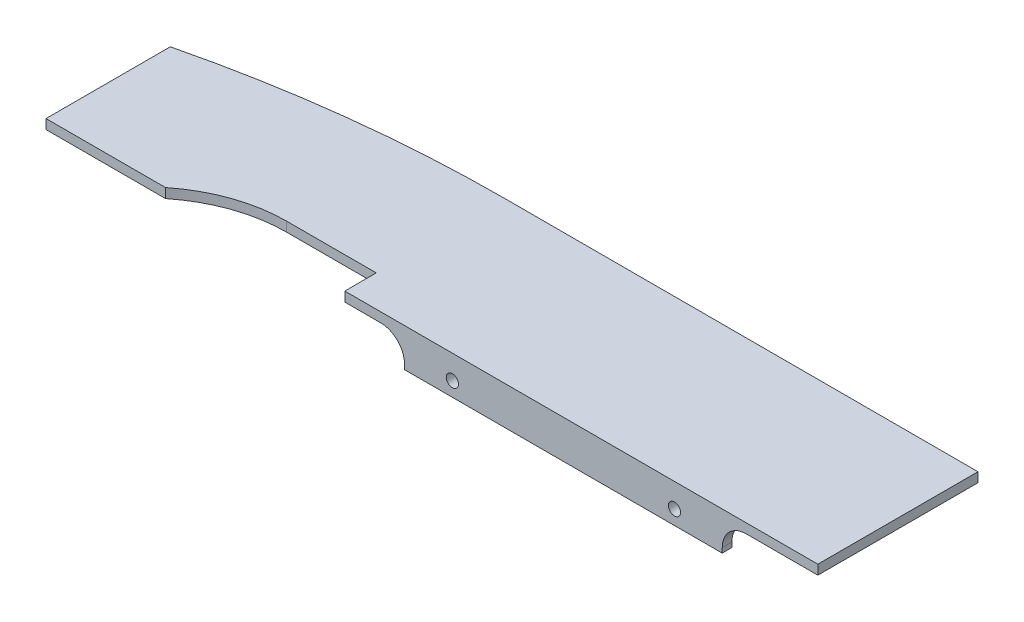
ISO-10303-21;
HEADER;
FILE_DESCRIPTION(('STEP AP214'),'2;1');
FILE_NAME('part.step','',(''),(''),'','','');
FILE_SCHEMA(('AUTOMOTIVE_DESIGN { 1 0 10303 214 1 1 1 1 }'));
ENDSEC;
DATA;
#1=APPLICATION_CONTEXT('core data for automotive mechanical design processes');
#2=APPLICATION_PROTOCOL_DEFINITION('international standard','automotive_design',2000,#1);
#3=PRODUCT_CONTEXT('',#1,'mechanical');
#4=PRODUCT('Part','Part','',(#3));
#5=PRODUCT_RELATED_PRODUCT_CATEGORY('part','',(#4));
#6=PRODUCT_DEFINITION_FORMATION('','',#4);
#7=PRODUCT_DEFINITION_CONTEXT('part definition',#1,'design');
#8=PRODUCT_DEFINITION('design','',#6,#7);
#9=PRODUCT_DEFINITION_SHAPE('','',#8);
#10=(LENGTH_UNIT() NAMED_UNIT(*) SI_UNIT(.MILLI.,.METRE.));
#11=(NAMED_UNIT(*) PLANE_ANGLE_UNIT() SI_UNIT($,.RADIAN.));
#12=(NAMED_UNIT(*) SI_UNIT($,.STERADIAN.) SOLID_ANGLE_UNIT());
#13=UNCERTAINTY_MEASURE_WITH_UNIT(LENGTH_MEASURE(1.E-05),#10,'distance_accuracy_value','');
#14=(GEOMETRIC_REPRESENTATION_CONTEXT(3) GLOBAL_UNCERTAINTY_ASSIGNED_CONTEXT((#13)) GLOBAL_UNIT_ASSIGNED_CONTEXT((#10,
#11,#12)) REPRESENTATION_CONTEXT('',''));
#15=CARTESIAN_POINT('',(0.,0.,0.));
#16=DIRECTION('',(0.,0.,1.));
#17=DIRECTION('',(1.,0.,0.));
#18=AXIS2_PLACEMENT_3D('',#15,#16,#17);
#19=CARTESIAN_POINT('',(-207.917449812527,59.7999999999989,0.));
#20=DIRECTION('',(1.,0.,0.));
#21=DIRECTION('',(0.,1.,0.));
#22=AXIS2_PLACEMENT_3D('',#19,#20,#21);
#23=PLANE('',#22);
#24=DIRECTION('',(0.,1.,0.));
#25=VECTOR('',#24,1.);
#26=CARTESIAN_POINT('',(-207.917449812527,-86.0238343861886,53.8374849879851));
#27=LINE('',#26,#25);
#28=CARTESIAN_POINT('',(-207.917449812527,55.7999999999989,53.8374849879851));
#29=VERTEX_POINT('',#28);
#30=CARTESIAN_POINT('',(-207.917449812527,59.7999999999989,53.8374849879851));
#31=VERTEX_POINT('',#30);
#32=EDGE_CURVE('E63',#29,#31,#27,.T.);
#33=ORIENTED_EDGE('',*,*,#32,.F.);
#34=DIRECTION('',(0.,0.,1.));
#35=VECTOR('',#34,1.);
#36=CARTESIAN_POINT('',(-207.917449812527,55.7999999999989,0.));
#37=LINE('',#36,#35);
#38=CARTESIAN_POINT('',(-207.917449812527,55.7999999999989,66.9999999999997));
#39=VERTEX_POINT('',#38);
#40=EDGE_CURVE('E302',#29,#39,#37,.T.);
#41=ORIENTED_EDGE('',*,*,#40,.T.);
#42=DIRECTION('',(0.,-1.,0.));
#43=VECTOR('',#42,1.);
#44=CARTESIAN_POINT('',(-207.917449812527,59.7999999999989,66.9999999999997));
#45=LINE('',#44,#43);
#46=CARTESIAN_POINT('',(-207.917449812527,59.7999999999989,66.9999999999997));
#47=VERTEX_POINT('',#46);
#48=EDGE_CURVE('E340',#47,#39,#45,.T.);
#49=ORIENTED_EDGE('',*,*,#48,.F.);
#50=DIRECTION('',(0.,0.,1.));
#51=VECTOR('',#50,1.);
#52=CARTESIAN_POINT('',(-207.917449812527,59.7999999999989,0.));
#53=LINE('',#52,#51);
#54=EDGE_CURVE('E303',#31,#47,#53,.T.);
#55=ORIENTED_EDGE('',*,*,#54,.F.);
#56=EDGE_LOOP('',(#33,#41,#49,#55));
#57=FACE_BOUND('',#56,.T.);
#58=ADVANCED_FACE('F41',(#57),#23,.F.);
#59=CARTESIAN_POINT('',(-1.60418411700392E-13,55.7999999999995,0.));
#60=DIRECTION('',(0.,1.,0.));
#61=DIRECTION('',(-1.,0.,0.));
#62=AXIS2_PLACEMENT_3D('',#59,#60,#61);
#63=PLANE('',#62);
#64=DIRECTION('',(0.,0.,1.));
#65=VECTOR('',#64,1.);
#66=CARTESIAN_POINT('',(-40.,55.7999999999994,62.9999999999997));
#67=LINE('',#66,#65);
#68=CARTESIAN_POINT('',(-40.,55.7999999999994,66.9999999999997));
#69=VERTEX_POINT('',#68);
#70=CARTESIAN_POINT('',(-40.,55.7999999999994,60.4999999999997));
#71=VERTEX_POINT('',#70);
#72=EDGE_CURVE('E392',#69,#71,#67,.F.);
#73=ORIENTED_EDGE('',*,*,#72,.T.);
#74=DIRECTION('',(1.,0.,0.));
#75=VECTOR('',#74,1.);
#76=CARTESIAN_POINT('',(-1.60418411700392E-13,55.7999999999995,60.4999999999997));
#77=LINE('',#76,#75);
#78=CARTESIAN_POINT('',(-192.917449812531,55.7999999999989,60.4999999999997));
#79=VERTEX_POINT('',#78);
#80=EDGE_CURVE('E449',#71,#79,#77,.F.);
#81=ORIENTED_EDGE('',*,*,#80,.T.);
#82=DIRECTION('',(0.,0.,1.));
#83=VECTOR('',#82,1.);
#84=CARTESIAN_POINT('',(-192.917449812531,55.7999999999989,66.9999999999997));
#85=LINE('',#84,#83);
#86=CARTESIAN_POINT('',(-192.917449812531,55.7999999999989,66.9999999999997));
#87=VERTEX_POINT('',#86);
#88=EDGE_CURVE('E399',#79,#87,#85,.T.);
#89=ORIENTED_EDGE('',*,*,#88,.T.);
#90=DIRECTION('',(1.,0.,0.));
#91=VECTOR('',#90,1.);
#92=CARTESIAN_POINT('',(-207.917449812527,55.7999999999989,66.9999999999997));
#93=LINE('',#92,#91);
#94=EDGE_CURVE('E319',#39,#87,#93,.T.);
#95=ORIENTED_EDGE('',*,*,#94,.F.);
#96=ORIENTED_EDGE('',*,*,#40,.F.);
#97=DIRECTION('',(-1.,0.,0.));
#98=VECTOR('',#97,1.);
#99=CARTESIAN_POINT('',(-1.59871066857698E-13,55.7999999999995,53.8374849879851));
#100=LINE('',#99,#98);
#101=CARTESIAN_POINT('',(-245.41744981253,55.7999999999988,53.8374849879851));
#102=VERTEX_POINT('',#101);
#103=EDGE_CURVE('E578',#29,#102,#100,.T.);
#104=ORIENTED_EDGE('',*,*,#103,.T.);
#105=CARTESIAN_POINT('',(-245.41744981253,55.7999999999988,113.837484987985));
#106=DIRECTION('',(0.,1.,0.));
#107=DIRECTION('',(-1.,0.,0.));
#108=AXIS2_PLACEMENT_3D('',#105,#106,#107);
#109=CIRCLE('',#108,60.);
#110=CARTESIAN_POINT('',(-282.917449812533,55.7999999999987,66.9999999999996));
#111=VERTEX_POINT('',#110);
#112=EDGE_CURVE('E585',#102,#111,#109,.T.);
#113=ORIENTED_EDGE('',*,*,#112,.T.);
#114=DIRECTION('',(1.,0.,0.));
#115=VECTOR('',#114,1.);
#116=CARTESIAN_POINT('',(-1.59871066857698E-13,55.7999999999995,66.9999999999996));
#117=LINE('',#116,#115);
#118=CARTESIAN_POINT('',(-332.91744981253,55.7999999999986,66.9999999999996));
#119=VERTEX_POINT('',#118);
#120=EDGE_CURVE('E246',#119,#111,#117,.T.);
#121=ORIENTED_EDGE('',*,*,#120,.F.);
#122=DIRECTION('',(0.,0.,-1.));
#123=VECTOR('',#122,1.);
#124=CARTESIAN_POINT('',(-332.91744981253,55.7999999999986,0.));
#125=LINE('',#124,#123);
#126=CARTESIAN_POINT('',(-332.91744981253,55.7999999999986,15.));
#127=VERTEX_POINT('',#126);
#128=EDGE_CURVE('E255',#119,#127,#125,.T.);
#129=ORIENTED_EDGE('',*,*,#128,.T.);
#130=CARTESIAN_POINT('',(-207.917449812527,55.7999999999989,528.33333333336));
#131=DIRECTION('',(0.,1.,0.));
#132=DIRECTION('',(-1.,0.,0.));
#133=AXIS2_PLACEMENT_3D('',#130,#131,#132);
#134=CIRCLE('',#133,528.33333333336);
#135=CARTESIAN_POINT('',(-207.917449812527,55.7999999999989,0.));
#136=VERTEX_POINT('',#135);
#137=EDGE_CURVE('E209',#136,#127,#134,.T.);
#138=ORIENTED_EDGE('',*,*,#137,.F.);
#139=DIRECTION('',(-1.,0.,0.));
#140=VECTOR('',#139,1.);
#141=CARTESIAN_POINT('',(-207.917449812527,55.7999999999989,0.));
#142=LINE('',#141,#140);
#143=CARTESIAN_POINT('',(-192.917449812531,55.7999999999989,0.));
#144=VERTEX_POINT('',#143);
#145=EDGE_CURVE('E326',#144,#136,#142,.T.);
#146=ORIENTED_EDGE('',*,*,#145,.F.);
#147=DIRECTION('',(0.,0.,-1.));
#148=VECTOR('',#147,1.);
#149=CARTESIAN_POINT('',(-192.917449812531,55.7999999999989,4.));
#150=LINE('',#149,#148);
#151=CARTESIAN_POINT('',(-192.917449812531,55.7999999999989,6.5));
#152=VERTEX_POINT('',#151);
#153=EDGE_CURVE('E403',#144,#152,#150,.F.);
#154=ORIENTED_EDGE('',*,*,#153,.T.);
#155=DIRECTION('',(-1.,0.,0.));
#156=VECTOR('',#155,1.);
#157=CARTESIAN_POINT('',(-1.60418411700392E-13,55.7999999999995,6.5));
#158=LINE('',#157,#156);
#159=CARTESIAN_POINT('',(-40.,55.7999999999994,6.5));
#160=VERTEX_POINT('',#159);
#161=EDGE_CURVE('E445',#152,#160,#158,.F.);
#162=ORIENTED_EDGE('',*,*,#161,.T.);
#163=DIRECTION('',(0.,0.,-1.));
#164=VECTOR('',#163,1.);
#165=CARTESIAN_POINT('',(-40.,55.7999999999994,0.));
#166=LINE('',#165,#164);
#167=CARTESIAN_POINT('',(-40.,55.7999999999994,0.));
#168=VERTEX_POINT('',#167);
#169=EDGE_CURVE('E395',#160,#168,#166,.T.);
#170=ORIENTED_EDGE('',*,*,#169,.T.);
#171=CARTESIAN_POINT('',(-9.99999999999982,55.7999999999995,0.));
#172=VERTEX_POINT('',#171);
#173=EDGE_CURVE('E307',#172,#168,#142,.T.);
#174=ORIENTED_EDGE('',*,*,#173,.F.);
#175=DIRECTION('',(0.,0.,-1.));
#176=VECTOR('',#175,1.);
#177=CARTESIAN_POINT('',(-9.99999999999982,55.7999999999995,0.));
#178=LINE('',#177,#176);
#179=CARTESIAN_POINT('',(-9.99999999999984,55.7999999999995,66.9999999999997));
#180=VERTEX_POINT('',#179);
#181=EDGE_CURVE('E323',#180,#172,#178,.T.);
#182=ORIENTED_EDGE('',*,*,#181,.F.);
#183=EDGE_CURVE('E318',#69,#180,#93,.T.);
#184=ORIENTED_EDGE('',*,*,#183,.F.);
#185=EDGE_LOOP('',(#73,#81,#89,#95,#96,#104,#113,#121,#129,#138,#146,#154,#162,#170,#174,#182,#184));
#186=FACE_BOUND('',#185,.T.);
#187=ADVANCED_FACE('F488',(#186),#63,.F.);
#188=CARTESIAN_POINT('',(0.,0.,4.));
#189=DIRECTION('',(0.,0.,1.));
#190=DIRECTION('',(1.,0.,0.));
#191=AXIS2_PLACEMENT_3D('',#188,#189,#190);
#192=PLANE('',#191);
#193=CARTESIAN_POINT('',(-162.917449812531,49.7999999999995,4.));
#194=DIRECTION('',(0.,0.,1.));
#195=DIRECTION('',(1.,0.,0.));
#196=AXIS2_PLACEMENT_3D('',#193,#194,#195);
#197=CIRCLE('',#196,2.54999999999999);
#198=CARTESIAN_POINT('',(-160.367449812531,49.7999999999995,4.));
#199=VERTEX_POINT('',#198);
#200=EDGE_CURVE('E353',#199,#199,#197,.T.);
#201=ORIENTED_EDGE('',*,*,#200,.F.);
#202=EDGE_LOOP('',(#201));
#203=FACE_BOUND('',#202,.T.);
#204=CARTESIAN_POINT('',(-39.9999999999999,45.7999999999994,4.));
#205=DIRECTION('',(0.,0.,1.));
#206=DIRECTION('',(1.,0.,0.));
#207=AXIS2_PLACEMENT_3D('',#204,#205,#206);
#208=CIRCLE('',#207,10.);
#209=CARTESIAN_POINT('',(-49.9999999999999,45.7999999999994,4.));
#210=VERTEX_POINT('',#209);
#211=CARTESIAN_POINT('',(-46.6143782776614,53.2999999999994,4.));
#212=VERTEX_POINT('',#211);
#213=EDGE_CURVE('E432',#210,#212,#208,.F.);
#214=ORIENTED_EDGE('',*,*,#213,.T.);
#215=DIRECTION('',(-1.,0.,0.));
#216=VECTOR('',#215,1.);
#217=CARTESIAN_POINT('',(-1.53231206875105E-13,53.2999999999995,4.));
#218=LINE('',#217,#216);
#219=CARTESIAN_POINT('',(-186.303071534869,53.299999999999,4.));
#220=VERTEX_POINT('',#219);
#221=EDGE_CURVE('E453',#212,#220,#218,.T.);
#222=ORIENTED_EDGE('',*,*,#221,.T.);
#223=CARTESIAN_POINT('',(-192.917449812531,45.7999999999989,4.));
#224=DIRECTION('',(0.,0.,1.));
#225=DIRECTION('',(1.,0.,0.));
#226=AXIS2_PLACEMENT_3D('',#223,#224,#225);
#227=CIRCLE('',#226,10.);
#228=CARTESIAN_POINT('',(-182.917449812531,45.7999999999989,4.));
#229=VERTEX_POINT('',#228);
#230=EDGE_CURVE('E419',#220,#229,#227,.F.);
#231=ORIENTED_EDGE('',*,*,#230,.T.);
#232=DIRECTION('',(0.,-1.,0.));
#233=VECTOR('',#232,1.);
#234=CARTESIAN_POINT('',(-182.917449812531,55.7999999999995,4.));
#235=LINE('',#234,#233);
#236=CARTESIAN_POINT('',(-182.917449812531,43.7999999999995,4.));
#237=VERTEX_POINT('',#236);
#238=EDGE_CURVE('E361',#229,#237,#235,.T.);
#239=ORIENTED_EDGE('',*,*,#238,.T.);
#240=DIRECTION('',(1.,0.,0.));
#241=VECTOR('',#240,1.);
#242=CARTESIAN_POINT('',(-182.917449812531,43.7999999999995,4.));
#243=LINE('',#242,#241);
#244=CARTESIAN_POINT('',(-49.9999999999999,43.7999999999995,4.));
#245=VERTEX_POINT('',#244);
#246=EDGE_CURVE('E364',#237,#245,#243,.T.);
#247=ORIENTED_EDGE('',*,*,#246,.T.);
#248=DIRECTION('',(0.,1.,0.));
#249=VECTOR('',#248,1.);
#250=CARTESIAN_POINT('',(-49.9999999999999,55.7999999999995,4.));
#251=LINE('',#250,#249);
#252=EDGE_CURVE('E368',#245,#210,#251,.T.);
#253=ORIENTED_EDGE('',*,*,#252,.T.);
#254=EDGE_LOOP('',(#214,#222,#231,#239,#247,#253));
#255=FACE_BOUND('',#254,.T.);
#256=CARTESIAN_POINT('',(-69.9999999999999,49.7999999999995,4.));
#257=DIRECTION('',(0.,0.,1.));
#258=DIRECTION('',(1.,0.,0.));
#259=AXIS2_PLACEMENT_3D('',#256,#257,#258);
#260=CIRCLE('',#259,2.54999999999999);
#261=CARTESIAN_POINT('',(-67.4499999999999,49.7999999999995,4.));
#262=VERTEX_POINT('',#261);
#263=EDGE_CURVE('E345',#262,#262,#260,.T.);
#264=ORIENTED_EDGE('',*,*,#263,.F.);
#265=EDGE_LOOP('',(#264));
#266=FACE_BOUND('',#265,.T.);
#267=ADVANCED_FACE('F495',(#203,#255,#266),#192,.T.);
#268=CARTESIAN_POINT('',(0.,0.,0.));
#269=DIRECTION('',(0.,0.,1.));
#270=DIRECTION('',(1.,0.,0.));
#271=AXIS2_PLACEMENT_3D('',#268,#269,#270);
#272=PLANE('',#271);
#273=DIRECTION('',(0.,-1.,0.));
#274=VECTOR('',#273,1.);
#275=CARTESIAN_POINT('',(-182.917449812531,55.7999999999995,0.));
#276=LINE('',#275,#274);
#277=CARTESIAN_POINT('',(-182.917449812531,45.7999999999989,0.));
#278=VERTEX_POINT('',#277);
#279=CARTESIAN_POINT('',(-182.917449812531,43.7999999999995,0.));
#280=VERTEX_POINT('',#279);
#281=EDGE_CURVE('E357',#278,#280,#276,.T.);
#282=ORIENTED_EDGE('',*,*,#281,.F.);
#283=CARTESIAN_POINT('',(-192.917449812531,45.7999999999989,0.));
#284=DIRECTION('',(0.,0.,1.));
#285=DIRECTION('',(1.,0.,0.));
#286=AXIS2_PLACEMENT_3D('',#283,#284,#285);
#287=CIRCLE('',#286,10.);
#288=EDGE_CURVE('E416',#278,#144,#287,.T.);
#289=ORIENTED_EDGE('',*,*,#288,.T.);
#290=ORIENTED_EDGE('',*,*,#145,.T.);
#291=DIRECTION('',(0.,-1.,0.));
#292=VECTOR('',#291,1.);
#293=CARTESIAN_POINT('',(-207.917449812527,59.7999999999989,0.));
#294=LINE('',#293,#292);
#295=CARTESIAN_POINT('',(-207.917449812527,59.7999999999989,0.));
#296=VERTEX_POINT('',#295);
#297=EDGE_CURVE('E315',#296,#136,#294,.T.);
#298=ORIENTED_EDGE('',*,*,#297,.F.);
#299=DIRECTION('',(-1.,0.,0.));
#300=VECTOR('',#299,1.);
#301=CARTESIAN_POINT('',(-207.917449812527,59.7999999999989,0.));
#302=LINE('',#301,#300);
#303=CARTESIAN_POINT('',(-9.99999999999983,59.7999999999995,0.));
#304=VERTEX_POINT('',#303);
#305=EDGE_CURVE('E223',#304,#296,#302,.T.);
#306=ORIENTED_EDGE('',*,*,#305,.F.);
#307=DIRECTION('',(0.,-1.,0.));
#308=VECTOR('',#307,1.);
#309=CARTESIAN_POINT('',(-9.99999999999983,59.7999999999995,0.));
#310=LINE('',#309,#308);
#311=EDGE_CURVE('E332',#304,#172,#310,.T.);
#312=ORIENTED_EDGE('',*,*,#311,.T.);
#313=ORIENTED_EDGE('',*,*,#173,.T.);
#314=CARTESIAN_POINT('',(-39.9999999999999,45.7999999999994,0.));
#315=DIRECTION('',(0.,0.,1.));
#316=DIRECTION('',(1.,0.,0.));
#317=AXIS2_PLACEMENT_3D('',#314,#315,#316);
#318=CIRCLE('',#317,10.);
#319=CARTESIAN_POINT('',(-49.9999999999999,45.7999999999994,0.));
#320=VERTEX_POINT('',#319);
#321=EDGE_CURVE('E429',#168,#320,#318,.T.);
#322=ORIENTED_EDGE('',*,*,#321,.T.);
#323=DIRECTION('',(0.,1.,0.));
#324=VECTOR('',#323,1.);
#325=CARTESIAN_POINT('',(-49.9999999999999,55.7999999999995,0.));
#326=LINE('',#325,#324);
#327=CARTESIAN_POINT('',(-49.9999999999999,43.7999999999995,0.));
#328=VERTEX_POINT('',#327);
#329=EDGE_CURVE('E365',#328,#320,#326,.T.);
#330=ORIENTED_EDGE('',*,*,#329,.F.);
#331=DIRECTION('',(1.,0.,0.));
#332=VECTOR('',#331,1.);
#333=CARTESIAN_POINT('',(-182.917449812531,43.7999999999995,0.));
#334=LINE('',#333,#332);
#335=EDGE_CURVE('E375',#280,#328,#334,.T.);
#336=ORIENTED_EDGE('',*,*,#335,.F.);
#337=EDGE_LOOP('',(#282,#289,#290,#298,#306,#312,#313,#322,#330,#336));
#338=FACE_BOUND('',#337,.T.);
#339=CARTESIAN_POINT('',(-162.917449812531,49.7999999999995,0.));
#340=DIRECTION('',(0.,0.,1.));
#341=DIRECTION('',(1.,0.,0.));
#342=AXIS2_PLACEMENT_3D('',#339,#340,#341);
#343=CIRCLE('',#342,2.54999999999999);
#344=CARTESIAN_POINT('',(-160.367449812531,49.7999999999995,0.));
#345=VERTEX_POINT('',#344);
#346=EDGE_CURVE('E349',#345,#345,#343,.T.);
#347=ORIENTED_EDGE('',*,*,#346,.T.);
#348=EDGE_LOOP('',(#347));
#349=FACE_BOUND('',#348,.T.);
#350=CARTESIAN_POINT('',(-69.9999999999999,49.7999999999995,0.));
#351=DIRECTION('',(0.,0.,1.));
#352=DIRECTION('',(1.,0.,0.));
#353=AXIS2_PLACEMENT_3D('',#350,#351,#352);
#354=CIRCLE('',#353,2.54999999999999);
#355=CARTESIAN_POINT('',(-67.4499999999999,49.7999999999995,0.));
#356=VERTEX_POINT('',#355);
#357=EDGE_CURVE('E344',#356,#356,#354,.T.);
#358=ORIENTED_EDGE('',*,*,#357,.T.);
#359=EDGE_LOOP('',(#358));
#360=FACE_BOUND('',#359,.T.);
#361=ADVANCED_FACE('F513',(#338,#349,#360),#272,.F.);
#362=CARTESIAN_POINT('',(-182.917449812531,55.7999999999995,4.));
#363=DIRECTION('',(1.,0.,0.));
#364=DIRECTION('',(0.,0.,-1.));
#365=AXIS2_PLACEMENT_3D('',#362,#363,#364);
#366=PLANE('',#365);
#367=ORIENTED_EDGE('',*,*,#238,.F.);
#368=DIRECTION('',(0.,0.,-1.));
#369=VECTOR('',#368,1.);
#370=CARTESIAN_POINT('',(-182.917449812531,45.7999999999989,0.));
#371=LINE('',#370,#369);
#372=EDGE_CURVE('E388',#229,#278,#371,.T.);
#373=ORIENTED_EDGE('',*,*,#372,.T.);
#374=ORIENTED_EDGE('',*,*,#281,.T.);
#375=DIRECTION('',(0.,0.,-1.));
#376=VECTOR('',#375,1.);
#377=CARTESIAN_POINT('',(-182.917449812531,43.7999999999995,4.));
#378=LINE('',#377,#376);
#379=EDGE_CURVE('E384',#237,#280,#378,.T.);
#380=ORIENTED_EDGE('',*,*,#379,.F.);
#381=EDGE_LOOP('',(#367,#373,#374,#380));
#382=FACE_BOUND('',#381,.T.);
#383=ADVANCED_FACE('F517',(#382),#366,.F.);
#384=CARTESIAN_POINT('',(-182.917449812531,43.7999999999995,4.));
#385=DIRECTION('',(0.,1.,0.));
#386=DIRECTION('',(0.,0.,1.));
#387=AXIS2_PLACEMENT_3D('',#384,#385,#386);
#388=PLANE('',#387);
#389=ORIENTED_EDGE('',*,*,#335,.T.);
#390=DIRECTION('',(0.,0.,-1.));
#391=VECTOR('',#390,1.);
#392=CARTESIAN_POINT('',(-49.9999999999999,43.7999999999995,4.));
#393=LINE('',#392,#391);
#394=EDGE_CURVE('E372',#245,#328,#393,.T.);
#395=ORIENTED_EDGE('',*,*,#394,.F.);
#396=ORIENTED_EDGE('',*,*,#246,.F.);
#397=ORIENTED_EDGE('',*,*,#379,.T.);
#398=EDGE_LOOP('',(#389,#395,#396,#397));
#399=FACE_BOUND('',#398,.T.);
#400=ADVANCED_FACE('F521',(#399),#388,.F.);
#401=CARTESIAN_POINT('',(-49.9999999999999,55.7999999999995,4.));
#402=DIRECTION('',(-1.,0.,0.));
#403=DIRECTION('',(0.,0.,1.));
#404=AXIS2_PLACEMENT_3D('',#401,#402,#403);
#405=PLANE('',#404);
#406=ORIENTED_EDGE('',*,*,#329,.T.);
#407=DIRECTION('',(0.,0.,-1.));
#408=VECTOR('',#407,1.);
#409=CARTESIAN_POINT('',(-49.9999999999999,45.7999999999994,4.));
#410=LINE('',#409,#408);
#411=EDGE_CURVE('E409',#320,#210,#410,.F.);
#412=ORIENTED_EDGE('',*,*,#411,.T.);
#413=ORIENTED_EDGE('',*,*,#252,.F.);
#414=ORIENTED_EDGE('',*,*,#394,.T.);
#415=EDGE_LOOP('',(#406,#412,#413,#414));
#416=FACE_BOUND('',#415,.T.);
#417=ADVANCED_FACE('F509',(#416),#405,.F.);
#418=CARTESIAN_POINT('',(-162.917449812531,49.7999999999995,4.));
#419=DIRECTION('',(0.,0.,-1.));
#420=DIRECTION('',(-1.,0.,0.));
#421=AXIS2_PLACEMENT_3D('',#418,#419,#420);
#422=CYLINDRICAL_SURFACE('',#421,2.54999999999999);
#423=ORIENTED_EDGE('',*,*,#200,.T.);
#424=EDGE_LOOP('',(#423));
#425=FACE_BOUND('',#424,.T.);
#426=ORIENTED_EDGE('',*,*,#346,.F.);
#427=EDGE_LOOP('',(#426));
#428=FACE_BOUND('',#427,.T.);
#429=ADVANCED_FACE('F505',(#425,#428),#422,.F.);
#430=CARTESIAN_POINT('',(-69.9999999999999,49.7999999999995,4.));
#431=DIRECTION('',(0.,0.,-1.));
#432=DIRECTION('',(-1.,0.,0.));
#433=AXIS2_PLACEMENT_3D('',#430,#431,#432);
#434=CYLINDRICAL_SURFACE('',#433,2.54999999999999);
#435=ORIENTED_EDGE('',*,*,#263,.T.);
#436=EDGE_LOOP('',(#435));
#437=FACE_BOUND('',#436,.T.);
#438=ORIENTED_EDGE('',*,*,#357,.F.);
#439=EDGE_LOOP('',(#438));
#440=FACE_BOUND('',#439,.T.);
#441=ADVANCED_FACE('F502',(#437,#440),#434,.F.);
#442=CARTESIAN_POINT('',(-207.917449812527,59.7999999999989,66.9999999999997));
#443=DIRECTION('',(0.,0.,-1.));
#444=DIRECTION('',(-1.,0.,0.));
#445=AXIS2_PLACEMENT_3D('',#442,#443,#444);
#446=PLANE('',#445);
#447=ORIENTED_EDGE('',*,*,#94,.T.);
#448=CARTESIAN_POINT('',(-192.917449812531,45.7999999999989,66.9999999999997));
#449=DIRECTION('',(0.,0.,-1.));
#450=DIRECTION('',(-1.,0.,0.));
#451=AXIS2_PLACEMENT_3D('',#448,#449,#450);
#452=CIRCLE('',#451,10.);
#453=CARTESIAN_POINT('',(-182.917449812531,45.7999999999989,66.9999999999997));
#454=VERTEX_POINT('',#453);
#455=EDGE_CURVE('E422',#87,#454,#452,.T.);
#456=ORIENTED_EDGE('',*,*,#455,.T.);
#457=DIRECTION('',(0.,1.,0.));
#458=VECTOR('',#457,1.);
#459=CARTESIAN_POINT('',(-182.917449812531,43.7999999999995,66.9999999999997));
#460=LINE('',#459,#458);
#461=CARTESIAN_POINT('',(-182.917449812531,43.7999999999995,66.9999999999997));
#462=VERTEX_POINT('',#461);
#463=EDGE_CURVE('E279',#462,#454,#460,.T.);
#464=ORIENTED_EDGE('',*,*,#463,.F.);
#465=DIRECTION('',(-1.,0.,0.));
#466=VECTOR('',#465,1.);
#467=CARTESIAN_POINT('',(-49.9999999999999,43.7999999999995,66.9999999999997));
#468=LINE('',#467,#466);
#469=CARTESIAN_POINT('',(-49.9999999999999,43.7999999999995,66.9999999999997));
#470=VERTEX_POINT('',#469);
#471=EDGE_CURVE('E289',#470,#462,#468,.T.);
#472=ORIENTED_EDGE('',*,*,#471,.F.);
#473=DIRECTION('',(0.,-1.,0.));
#474=VECTOR('',#473,1.);
#475=CARTESIAN_POINT('',(-49.9999999999999,55.7999999999995,66.9999999999997));
#476=LINE('',#475,#474);
#477=CARTESIAN_POINT('',(-49.9999999999999,45.7999999999994,66.9999999999997));
#478=VERTEX_POINT('',#477);
#479=EDGE_CURVE('E271',#478,#470,#476,.T.);
#480=ORIENTED_EDGE('',*,*,#479,.F.);
#481=CARTESIAN_POINT('',(-39.9999999999999,45.7999999999994,66.9999999999997));
#482=DIRECTION('',(0.,0.,-1.));
#483=DIRECTION('',(-1.,0.,0.));
#484=AXIS2_PLACEMENT_3D('',#481,#482,#483);
#485=CIRCLE('',#484,10.);
#486=EDGE_CURVE('E435',#478,#69,#485,.T.);
#487=ORIENTED_EDGE('',*,*,#486,.T.);
#488=ORIENTED_EDGE('',*,*,#183,.T.);
#489=DIRECTION('',(0.,-1.,0.));
#490=VECTOR('',#489,1.);
#491=CARTESIAN_POINT('',(-9.99999999999985,59.7999999999995,66.9999999999997));
#492=LINE('',#491,#490);
#493=CARTESIAN_POINT('',(-9.99999999999985,59.7999999999995,66.9999999999997));
#494=VERTEX_POINT('',#493);
#495=EDGE_CURVE('E336',#494,#180,#492,.T.);
#496=ORIENTED_EDGE('',*,*,#495,.F.);
#497=DIRECTION('',(1.,0.,0.));
#498=VECTOR('',#497,1.);
#499=CARTESIAN_POINT('',(-207.917449812527,59.7999999999989,66.9999999999997));
#500=LINE('',#499,#498);
#501=EDGE_CURVE('E306',#47,#494,#500,.T.);
#502=ORIENTED_EDGE('',*,*,#501,.F.);
#503=ORIENTED_EDGE('',*,*,#48,.T.);
#504=EDGE_LOOP('',(#447,#456,#464,#472,#480,#487,#488,#496,#502,#503));
#505=FACE_BOUND('',#504,.T.);
#506=CARTESIAN_POINT('',(-162.917449812531,49.7999999999995,66.9999999999997));
#507=DIRECTION('',(0.,0.,-1.));
#508=DIRECTION('',(-1.,0.,0.));
#509=AXIS2_PLACEMENT_3D('',#506,#507,#508);
#510=CIRCLE('',#509,2.54999999999999);
#511=CARTESIAN_POINT('',(-165.467449812531,49.7999999999995,66.9999999999997));
#512=VERTEX_POINT('',#511);
#513=EDGE_CURVE('E263',#512,#512,#510,.T.);
#514=ORIENTED_EDGE('',*,*,#513,.T.);
#515=EDGE_LOOP('',(#514));
#516=FACE_BOUND('',#515,.T.);
#517=CARTESIAN_POINT('',(-69.9999999999999,49.7999999999995,66.9999999999997));
#518=DIRECTION('',(0.,0.,-1.));
#519=DIRECTION('',(-1.,0.,0.));
#520=AXIS2_PLACEMENT_3D('',#517,#518,#519);
#521=CIRCLE('',#520,2.54999999999999);
#522=CARTESIAN_POINT('',(-72.5499999999999,49.7999999999995,66.9999999999997));
#523=VERTEX_POINT('',#522);
#524=EDGE_CURVE('E258',#523,#523,#521,.T.);
#525=ORIENTED_EDGE('',*,*,#524,.T.);
#526=EDGE_LOOP('',(#525));
#527=FACE_BOUND('',#526,.T.);
#528=ADVANCED_FACE('F500',(#505,#516,#527),#446,.F.);
#529=CARTESIAN_POINT('',(-9.99999999999983,59.7999999999995,0.));
#530=DIRECTION('',(-1.,0.,0.));
#531=DIRECTION('',(0.,-1.,0.));
#532=AXIS2_PLACEMENT_3D('',#529,#530,#531);
#533=PLANE('',#532);
#534=ORIENTED_EDGE('',*,*,#181,.T.);
#535=ORIENTED_EDGE('',*,*,#311,.F.);
#536=DIRECTION('',(0.,0.,-1.));
#537=VECTOR('',#536,1.);
#538=CARTESIAN_POINT('',(-9.99999999999983,59.7999999999995,0.));
#539=LINE('',#538,#537);
#540=EDGE_CURVE('E310',#494,#304,#539,.T.);
#541=ORIENTED_EDGE('',*,*,#540,.F.);
#542=ORIENTED_EDGE('',*,*,#495,.T.);
#543=EDGE_LOOP('',(#534,#535,#541,#542));
#544=FACE_BOUND('',#543,.T.);
#545=ADVANCED_FACE('F604',(#544),#533,.F.);
#546=CARTESIAN_POINT('',(-1.71903409802693E-13,59.7999999999995,0.));
#547=DIRECTION('',(0.,1.,0.));
#548=DIRECTION('',(-1.,0.,0.));
#549=AXIS2_PLACEMENT_3D('',#546,#547,#548);
#550=PLANE('',#549);
#551=ORIENTED_EDGE('',*,*,#305,.T.);
#552=CARTESIAN_POINT('',(-207.917449812527,59.7999999999989,528.33333333336));
#553=DIRECTION('',(0.,1.,0.));
#554=DIRECTION('',(-1.,0.,0.));
#555=AXIS2_PLACEMENT_3D('',#552,#553,#554);
#556=CIRCLE('',#555,528.33333333336);
#557=CARTESIAN_POINT('',(-332.91744981253,59.7999999999985,15.));
#558=VERTEX_POINT('',#557);
#559=EDGE_CURVE('E207',#558,#296,#556,.F.);
#560=ORIENTED_EDGE('',*,*,#559,.F.);
#561=DIRECTION('',(0.,0.,1.));
#562=VECTOR('',#561,1.);
#563=CARTESIAN_POINT('',(-332.91744981253,59.7999999999986,0.));
#564=LINE('',#563,#562);
#565=CARTESIAN_POINT('',(-332.91744981253,59.7999999999986,66.9999999999996));
#566=VERTEX_POINT('',#565);
#567=EDGE_CURVE('E221',#558,#566,#564,.T.);
#568=ORIENTED_EDGE('',*,*,#567,.T.);
#569=DIRECTION('',(-1.,0.,0.));
#570=VECTOR('',#569,1.);
#571=CARTESIAN_POINT('',(-1.71370594578156E-13,59.7999999999995,66.9999999999996));
#572=LINE('',#571,#570);
#573=CARTESIAN_POINT('',(-282.917449812533,59.7999999999987,66.9999999999996));
#574=VERTEX_POINT('',#573);
#575=EDGE_CURVE('E231',#574,#566,#572,.T.);
#576=ORIENTED_EDGE('',*,*,#575,.F.);
#577=CARTESIAN_POINT('',(-245.41744981253,59.7999999999988,113.837484987985));
#578=DIRECTION('',(0.,1.,0.));
#579=DIRECTION('',(-1.,0.,0.));
#580=AXIS2_PLACEMENT_3D('',#577,#578,#579);
#581=CIRCLE('',#580,60.);
#582=CARTESIAN_POINT('',(-245.41744981253,59.7999999999988,53.8374849879851));
#583=VERTEX_POINT('',#582);
#584=EDGE_CURVE('E234',#574,#583,#581,.F.);
#585=ORIENTED_EDGE('',*,*,#584,.T.);
#586=DIRECTION('',(1.,0.,0.));
#587=VECTOR('',#586,1.);
#588=CARTESIAN_POINT('',(-1.71370594578156E-13,59.7999999999995,53.8374849879851));
#589=LINE('',#588,#587);
#590=EDGE_CURVE('E215',#583,#31,#589,.T.);
#591=ORIENTED_EDGE('',*,*,#590,.T.);
#592=ORIENTED_EDGE('',*,*,#54,.T.);
#593=ORIENTED_EDGE('',*,*,#501,.T.);
#594=ORIENTED_EDGE('',*,*,#540,.T.);
#595=EDGE_LOOP('',(#551,#560,#568,#576,#585,#591,#592,#593,#594));
#596=FACE_BOUND('',#595,.T.);
#597=ADVANCED_FACE('F219',(#596),#550,.T.);
#598=CARTESIAN_POINT('',(0.,0.,62.9999999999997));
#599=DIRECTION('',(0.,0.,-1.));
#600=DIRECTION('',(-1.,0.,0.));
#601=AXIS2_PLACEMENT_3D('',#598,#599,#600);
#602=PLANE('',#601);
#603=CARTESIAN_POINT('',(-162.917449812531,49.7999999999995,62.9999999999997));
#604=DIRECTION('',(0.,0.,-1.));
#605=DIRECTION('',(-1.,0.,0.));
#606=AXIS2_PLACEMENT_3D('',#603,#604,#605);
#607=CIRCLE('',#606,2.54999999999999);
#608=CARTESIAN_POINT('',(-165.467449812531,49.7999999999995,62.9999999999997));
#609=VERTEX_POINT('',#608);
#610=EDGE_CURVE('E267',#609,#609,#607,.T.);
#611=ORIENTED_EDGE('',*,*,#610,.F.);
#612=EDGE_LOOP('',(#611));
#613=FACE_BOUND('',#612,.T.);
#614=CARTESIAN_POINT('',(-192.917449812531,45.7999999999989,62.9999999999997));
#615=DIRECTION('',(0.,0.,-1.));
#616=DIRECTION('',(-1.,0.,0.));
#617=AXIS2_PLACEMENT_3D('',#614,#615,#616);
#618=CIRCLE('',#617,10.);
#619=CARTESIAN_POINT('',(-182.917449812531,45.7999999999989,62.9999999999997));
#620=VERTEX_POINT('',#619);
#621=CARTESIAN_POINT('',(-186.303071534869,53.299999999999,62.9999999999997));
#622=VERTEX_POINT('',#621);
#623=EDGE_CURVE('E425',#620,#622,#618,.F.);
#624=ORIENTED_EDGE('',*,*,#623,.T.);
#625=DIRECTION('',(1.,0.,0.));
#626=VECTOR('',#625,1.);
#627=CARTESIAN_POINT('',(-1.53231206875105E-13,53.2999999999995,62.9999999999997));
#628=LINE('',#627,#626);
#629=CARTESIAN_POINT('',(-46.6143782776614,53.2999999999994,62.9999999999997));
#630=VERTEX_POINT('',#629);
#631=EDGE_CURVE('E441',#622,#630,#628,.T.);
#632=ORIENTED_EDGE('',*,*,#631,.T.);
#633=CARTESIAN_POINT('',(-39.9999999999999,45.7999999999994,62.9999999999997));
#634=DIRECTION('',(0.,0.,-1.));
#635=DIRECTION('',(-1.,0.,0.));
#636=AXIS2_PLACEMENT_3D('',#633,#634,#635);
#637=CIRCLE('',#636,10.);
#638=CARTESIAN_POINT('',(-49.9999999999999,45.7999999999994,62.9999999999997));
#639=VERTEX_POINT('',#638);
#640=EDGE_CURVE('E438',#630,#639,#637,.F.);
#641=ORIENTED_EDGE('',*,*,#640,.T.);
#642=DIRECTION('',(0.,-1.,0.));
#643=VECTOR('',#642,1.);
#644=CARTESIAN_POINT('',(-49.9999999999999,55.7999999999995,62.9999999999997));
#645=LINE('',#644,#643);
#646=CARTESIAN_POINT('',(-49.9999999999999,43.7999999999995,62.9999999999997));
#647=VERTEX_POINT('',#646);
#648=EDGE_CURVE('E275',#639,#647,#645,.T.);
#649=ORIENTED_EDGE('',*,*,#648,.T.);
#650=DIRECTION('',(-1.,0.,0.));
#651=VECTOR('',#650,1.);
#652=CARTESIAN_POINT('',(-49.9999999999999,43.7999999999995,62.9999999999997));
#653=LINE('',#652,#651);
#654=CARTESIAN_POINT('',(-182.917449812531,43.7999999999995,62.9999999999997));
#655=VERTEX_POINT('',#654);
#656=EDGE_CURVE('E278',#647,#655,#653,.T.);
#657=ORIENTED_EDGE('',*,*,#656,.T.);
#658=DIRECTION('',(0.,1.,0.));
#659=VECTOR('',#658,1.);
#660=CARTESIAN_POINT('',(-182.917449812531,43.7999999999995,62.9999999999997));
#661=LINE('',#660,#659);
#662=EDGE_CURVE('E282',#655,#620,#661,.T.);
#663=ORIENTED_EDGE('',*,*,#662,.T.);
#664=EDGE_LOOP('',(#624,#632,#641,#649,#657,#663));
#665=FACE_BOUND('',#664,.T.);
#666=CARTESIAN_POINT('',(-69.9999999999999,49.7999999999995,62.9999999999997));
#667=DIRECTION('',(0.,0.,-1.));
#668=DIRECTION('',(-1.,0.,0.));
#669=AXIS2_PLACEMENT_3D('',#666,#667,#668);
#670=CIRCLE('',#669,2.54999999999999);
#671=CARTESIAN_POINT('',(-72.5499999999999,49.7999999999995,62.9999999999997));
#672=VERTEX_POINT('',#671);
#673=EDGE_CURVE('E259',#672,#672,#670,.T.);
#674=ORIENTED_EDGE('',*,*,#673,.F.);
#675=EDGE_LOOP('',(#674));
#676=FACE_BOUND('',#675,.T.);
#677=ADVANCED_FACE('F552',(#613,#665,#676),#602,.T.);
#678=CARTESIAN_POINT('',(-49.9999999999999,55.7999999999995,62.9999999999997));
#679=DIRECTION('',(-1.,0.,0.));
#680=DIRECTION('',(0.,0.,1.));
#681=AXIS2_PLACEMENT_3D('',#678,#679,#680);
#682=PLANE('',#681);
#683=ORIENTED_EDGE('',*,*,#648,.F.);
#684=DIRECTION('',(0.,0.,1.));
#685=VECTOR('',#684,1.);
#686=CARTESIAN_POINT('',(-49.9999999999999,45.7999999999994,66.9999999999997));
#687=LINE('',#686,#685);
#688=EDGE_CURVE('E412',#639,#478,#687,.T.);
#689=ORIENTED_EDGE('',*,*,#688,.T.);
#690=ORIENTED_EDGE('',*,*,#479,.T.);
#691=DIRECTION('',(0.,0.,1.));
#692=VECTOR('',#691,1.);
#693=CARTESIAN_POINT('',(-49.9999999999999,43.7999999999995,62.9999999999997));
#694=LINE('',#693,#692);
#695=EDGE_CURVE('E298',#647,#470,#694,.T.);
#696=ORIENTED_EDGE('',*,*,#695,.F.);
#697=EDGE_LOOP('',(#683,#689,#690,#696));
#698=FACE_BOUND('',#697,.T.);
#699=ADVANCED_FACE('F561',(#698),#682,.F.);
#700=CARTESIAN_POINT('',(-49.9999999999999,43.7999999999995,62.9999999999997));
#701=DIRECTION('',(0.,1.,0.));
#702=DIRECTION('',(0.,0.,1.));
#703=AXIS2_PLACEMENT_3D('',#700,#701,#702);
#704=PLANE('',#703);
#705=ORIENTED_EDGE('',*,*,#471,.T.);
#706=DIRECTION('',(0.,0.,1.));
#707=VECTOR('',#706,1.);
#708=CARTESIAN_POINT('',(-182.917449812531,43.7999999999995,62.9999999999997));
#709=LINE('',#708,#707);
#710=EDGE_CURVE('E286',#655,#462,#709,.T.);
#711=ORIENTED_EDGE('',*,*,#710,.F.);
#712=ORIENTED_EDGE('',*,*,#656,.F.);
#713=ORIENTED_EDGE('',*,*,#695,.T.);
#714=EDGE_LOOP('',(#705,#711,#712,#713));
#715=FACE_BOUND('',#714,.T.);
#716=ADVANCED_FACE('F567',(#715),#704,.F.);
#717=CARTESIAN_POINT('',(-182.917449812531,43.7999999999995,62.9999999999997));
#718=DIRECTION('',(1.,0.,0.));
#719=DIRECTION('',(0.,0.,-1.));
#720=AXIS2_PLACEMENT_3D('',#717,#718,#719);
#721=PLANE('',#720);
#722=ORIENTED_EDGE('',*,*,#463,.T.);
#723=DIRECTION('',(0.,0.,1.));
#724=VECTOR('',#723,1.);
#725=CARTESIAN_POINT('',(-182.917449812531,45.7999999999989,62.9999999999997));
#726=LINE('',#725,#724);
#727=EDGE_CURVE('E406',#454,#620,#726,.F.);
#728=ORIENTED_EDGE('',*,*,#727,.T.);
#729=ORIENTED_EDGE('',*,*,#662,.F.);
#730=ORIENTED_EDGE('',*,*,#710,.T.);
#731=EDGE_LOOP('',(#722,#728,#729,#730));
#732=FACE_BOUND('',#731,.T.);
#733=ADVANCED_FACE('F570',(#732),#721,.F.);
#734=CARTESIAN_POINT('',(-162.917449812531,49.7999999999995,62.9999999999997));
#735=DIRECTION('',(0.,0.,1.));
#736=DIRECTION('',(1.,0.,0.));
#737=AXIS2_PLACEMENT_3D('',#734,#735,#736);
#738=CYLINDRICAL_SURFACE('',#737,2.54999999999999);
#739=ORIENTED_EDGE('',*,*,#610,.T.);
#740=EDGE_LOOP('',(#739));
#741=FACE_BOUND('',#740,.T.);
#742=ORIENTED_EDGE('',*,*,#513,.F.);
#743=EDGE_LOOP('',(#742));
#744=FACE_BOUND('',#743,.T.);
#745=ADVANCED_FACE('F641',(#741,#744),#738,.F.);
#746=CARTESIAN_POINT('',(-69.9999999999999,49.7999999999995,62.9999999999997));
#747=DIRECTION('',(0.,0.,1.));
#748=DIRECTION('',(1.,0.,0.));
#749=AXIS2_PLACEMENT_3D('',#746,#747,#748);
#750=CYLINDRICAL_SURFACE('',#749,2.54999999999999);
#751=ORIENTED_EDGE('',*,*,#673,.T.);
#752=EDGE_LOOP('',(#751));
#753=FACE_BOUND('',#752,.T.);
#754=ORIENTED_EDGE('',*,*,#524,.F.);
#755=EDGE_LOOP('',(#754));
#756=FACE_BOUND('',#755,.T.);
#757=ADVANCED_FACE('F533',(#753,#756),#750,.F.);
#758=CARTESIAN_POINT('',(-192.917449812531,45.7999999999989,4.));
#759=DIRECTION('',(0.,0.,1.));
#760=DIRECTION('',(1.,0.,0.));
#761=AXIS2_PLACEMENT_3D('',#758,#759,#760);
#762=CYLINDRICAL_SURFACE('',#761,10.);
#763=ORIENTED_EDGE('',*,*,#230,.F.);
#764=CARTESIAN_POINT('',(-186.303071534869,53.299999999999,4.));
#765=CARTESIAN_POINT('',(-186.364109161843,53.3538318866533,4.00000330699025));
#766=CARTESIAN_POINT('',(-186.425790926334,53.4069034127837,4.00173827978029));
#767=CARTESIAN_POINT('',(-186.550310850419,53.5114293261227,4.00840558343006));
#768=CARTESIAN_POINT('',(-186.613148654627,53.5628841975698,4.01333694711142));
#769=CARTESIAN_POINT('',(-186.802996636318,53.7145215611289,4.03250257455089));
#770=CARTESIAN_POINT('',(-186.931590544691,53.8121963695927,4.05111057053023));
#771=CARTESIAN_POINT('',(-187.191049784965,53.9996198022808,4.09796146170786));
#772=CARTESIAN_POINT('',(-187.321888258921,54.0894262527336,4.12612504231683));
#773=CARTESIAN_POINT('',(-187.586315278454,54.261911384189,4.1906264600931));
#774=CARTESIAN_POINT('',(-187.719905579048,54.3445853302864,4.22696967040904));
#775=CARTESIAN_POINT('',(-188.064242926981,54.5467404014256,4.32867835964305));
#776=CARTESIAN_POINT('',(-188.276561541942,54.6611056552996,4.39894043402403));
#777=CARTESIAN_POINT('',(-188.705081997106,54.8726573829514,4.55222832241295));
#778=CARTESIAN_POINT('',(-188.921285177074,54.9698377994297,4.63525861775111));
#779=CARTESIAN_POINT('',(-189.357636650342,55.1479158670324,4.81151615579986));
#780=CARTESIAN_POINT('',(-189.577799308499,55.2287292440977,4.90479254122284));
#781=CARTESIAN_POINT('',(-190.020160196814,55.3739173596139,5.09873950969051));
#782=CARTESIAN_POINT('',(-190.242358069236,55.4382949317029,5.19940881428971));
#783=CARTESIAN_POINT('',(-190.868383298702,55.5966457055816,5.48966296311964));
#784=CARTESIAN_POINT('',(-191.274006663354,55.6725461734691,5.68541158658831));
#785=CARTESIAN_POINT('',(-192.086377517461,55.7737828304526,6.08450887236102));
#786=CARTESIAN_POINT('',(-192.493118853484,55.7992574160201,6.28783516827532));
#787=CARTESIAN_POINT('',(-192.905524179625,55.7999946596892,6.49403718489859));
#788=CARTESIAN_POINT('',(-192.91148703048,55.7999999926861,6.49701861039253));
#789=CARTESIAN_POINT('',(-192.917449812531,55.7999999999989,6.5));
#790=B_SPLINE_CURVE_WITH_KNOTS('',3,(#764,#765,#766,#767,#768,#769,#770,#771,#772,#773,#774,
#775,#776,#777,#778,#779,#780,#781,#782,#783,#784,#785,#786,#787,#788,#789),.UNSPECIFIED.,.F.,
.F.,(4,2,2,2,2,2,2,2,2,2,2,2,4),(0.,0.244096341863115,0.488118858411697,0.975171181732698,
1.45827587966291,1.9416988571742,2.69410806580188,3.44678195675,4.2032380033456,
4.95956354387037,6.32655490408028,7.68978925420547,7.70978926060644),.UNSPECIFIED.);
#791=EDGE_CURVE('E56',#220,#152,#790,.T.);
#792=ORIENTED_EDGE('',*,*,#791,.T.);
#793=ORIENTED_EDGE('',*,*,#153,.F.);
#794=ORIENTED_EDGE('',*,*,#288,.F.);
#795=ORIENTED_EDGE('',*,*,#372,.F.);
#796=EDGE_LOOP('',(#763,#792,#793,#794,#795));
#797=FACE_BOUND('',#796,.T.);
#798=ADVANCED_FACE('F529',(#797),#762,.F.);
#799=CARTESIAN_POINT('',(-192.917449812531,45.7999999999989,0.));
#800=DIRECTION('',(0.,0.,-1.));
#801=DIRECTION('',(-1.,0.,0.));
#802=AXIS2_PLACEMENT_3D('',#799,#800,#801);
#803=CYLINDRICAL_SURFACE('',#802,10.);
#804=ORIENTED_EDGE('',*,*,#623,.F.);
#805=ORIENTED_EDGE('',*,*,#727,.F.);
#806=ORIENTED_EDGE('',*,*,#455,.F.);
#807=ORIENTED_EDGE('',*,*,#88,.F.);
#808=CARTESIAN_POINT('',(-186.303071534869,53.299999999999,62.9999999999997));
#809=CARTESIAN_POINT('',(-186.364109161843,53.3538318866533,62.9999966930094));
#810=CARTESIAN_POINT('',(-186.425790926334,53.4069034127837,62.9982617202194));
#811=CARTESIAN_POINT('',(-186.550310850419,53.5114293261227,62.9915944165696));
#812=CARTESIAN_POINT('',(-186.613148654627,53.5628841975698,62.9866630528882));
#813=CARTESIAN_POINT('',(-186.802996636318,53.7145215611289,62.9674974254488));
#814=CARTESIAN_POINT('',(-186.931590544691,53.8121963695927,62.9488894294694));
#815=CARTESIAN_POINT('',(-187.191049784965,53.9996198022808,62.9020385382918));
#816=CARTESIAN_POINT('',(-187.32188825892,54.0894262527336,62.8738749576828));
#817=CARTESIAN_POINT('',(-187.586315278454,54.261911384189,62.8093735399066));
#818=CARTESIAN_POINT('',(-187.719905579048,54.3445853302864,62.7730303295906));
#819=CARTESIAN_POINT('',(-188.064242926981,54.5467404014256,62.6713216403566));
#820=CARTESIAN_POINT('',(-188.276561541942,54.6611056552996,62.6010595659756));
#821=CARTESIAN_POINT('',(-188.705081997106,54.8726573829514,62.4477716775867));
#822=CARTESIAN_POINT('',(-188.921285177074,54.9698377994297,62.3647413822486));
#823=CARTESIAN_POINT('',(-189.357636650342,55.1479158670324,62.1884838441998));
#824=CARTESIAN_POINT('',(-189.577799308499,55.2287292440977,62.0952074587768));
#825=CARTESIAN_POINT('',(-190.020160196814,55.3739173596139,61.9012604903092));
#826=CARTESIAN_POINT('',(-190.242358069236,55.4382949317029,61.80059118571));
#827=CARTESIAN_POINT('',(-190.868383298702,55.5966457055816,61.51033703688));
#828=CARTESIAN_POINT('',(-191.274006663354,55.6725461734691,61.3145884134114));
#829=CARTESIAN_POINT('',(-192.086377517461,55.7737828304526,60.9154911276387));
#830=CARTESIAN_POINT('',(-192.493118853484,55.7992574160201,60.7121648317245));
#831=CARTESIAN_POINT('',(-192.905524179625,55.7999946596892,60.5059628151011));
#832=CARTESIAN_POINT('',(-192.91148703048,55.7999999926861,60.5029813896071));
#833=CARTESIAN_POINT('',(-192.917449812531,55.7999999999989,60.4999999999997));
#834=B_SPLINE_CURVE_WITH_KNOTS('',3,(#808,#809,#810,#811,#812,#813,#814,#815,#816,#817,#818,
#819,#820,#821,#822,#823,#824,#825,#826,#827,#828,#829,#830,#831,#832,#833),.UNSPECIFIED.,.F.,
.F.,(4,2,2,2,2,2,2,2,2,2,2,2,4),(0.,0.24409634186318,0.488118858411736,0.975171181732701,
1.45827587966281,1.94169885717415,2.69410806580185,3.44678195674998,4.2032380033456,
4.95956354387034,6.32655490408022,7.68978925420547,7.70978926060645),.UNSPECIFIED.);
#835=EDGE_CURVE('E466',#79,#622,#834,.F.);
#836=ORIENTED_EDGE('',*,*,#835,.T.);
#837=EDGE_LOOP('',(#804,#805,#806,#807,#836));
#838=FACE_BOUND('',#837,.T.);
#839=ADVANCED_FACE('F532',(#838),#803,.F.);
#840=CARTESIAN_POINT('',(-39.9999999999999,45.7999999999994,0.));
#841=DIRECTION('',(0.,0.,1.));
#842=DIRECTION('',(1.,0.,0.));
#843=AXIS2_PLACEMENT_3D('',#840,#841,#842);
#844=CYLINDRICAL_SURFACE('',#843,10.);
#845=ORIENTED_EDGE('',*,*,#213,.F.);
#846=ORIENTED_EDGE('',*,*,#411,.F.);
#847=ORIENTED_EDGE('',*,*,#321,.F.);
#848=ORIENTED_EDGE('',*,*,#169,.F.);
#849=CARTESIAN_POINT('',(-46.6143782776614,53.2999999999994,4.));
#850=CARTESIAN_POINT('',(-46.5533406506874,53.3538318866538,4.00000330699025));
#851=CARTESIAN_POINT('',(-46.4916588861967,53.4069034127841,4.00173827978029));
#852=CARTESIAN_POINT('',(-46.3671389621115,53.5114293261232,4.00840558343006));
#853=CARTESIAN_POINT('',(-46.3043011579031,53.5628841975703,4.01333694711143));
#854=CARTESIAN_POINT('',(-46.1144531762123,53.7145215611295,4.03250257455091));
#855=CARTESIAN_POINT('',(-45.9858592678397,53.8121963695933,4.05111057053026));
#856=CARTESIAN_POINT('',(-45.7264000275652,53.9996198022813,4.0979614617079));
#857=CARTESIAN_POINT('',(-45.5955615536099,54.0894262527341,4.12612504231686));
#858=CARTESIAN_POINT('',(-45.3311345340764,54.2619113841895,4.19062646009311));
#859=CARTESIAN_POINT('',(-45.1975442334828,54.3445853302868,4.22696967040905));
#860=CARTESIAN_POINT('',(-44.85320688555,54.546740401426,4.32867835964304));
#861=CARTESIAN_POINT('',(-44.6408882705881,54.6611056553,4.39894043402402));
#862=CARTESIAN_POINT('',(-44.2123678154244,54.8726573829518,4.5522283224129));
#863=CARTESIAN_POINT('',(-43.9961646354567,54.9698377994301,4.63525861775103));
#864=CARTESIAN_POINT('',(-43.559813162189,55.1479158670328,4.81151615579981));
#865=CARTESIAN_POINT('',(-43.3396505040321,55.228729244098,4.90479254122284));
#866=CARTESIAN_POINT('',(-42.897289615717,55.3739173596143,5.09873950969043));
#867=CARTESIAN_POINT('',(-42.6750917432947,55.4382949317034,5.1994088142895));
#868=CARTESIAN_POINT('',(-42.0490665138291,55.596645705582,5.48966296311999));
#869=CARTESIAN_POINT('',(-41.6434431491775,55.6725461734695,5.68541158659015));
#870=CARTESIAN_POINT('',(-40.8310722950688,55.7737828304531,6.08450887235921));
#871=CARTESIAN_POINT('',(-40.4243309590435,55.7992574160207,6.28783516826838));
#872=CARTESIAN_POINT('',(-40.011925632905,55.7999946596897,6.4940371848984));
#873=CARTESIAN_POINT('',(-40.0059627820503,55.7999999926866,6.49701861039244));
#874=CARTESIAN_POINT('',(-40.,55.7999999999994,6.5));
#875=B_SPLINE_CURVE_WITH_KNOTS('',3,(#849,#850,#851,#852,#853,#854,#855,#856,#857,#858,#859,
#860,#861,#862,#863,#864,#865,#866,#867,#868,#869,#870,#871,#872,#873,#874),.UNSPECIFIED.,.F.,
.F.,(4,2,2,2,2,2,2,2,2,2,2,2,4),(0.,0.244096341863234,0.488118858411881,0.975171181733009,
1.458275879663,1.94169885717418,2.69410806580178,3.4467819567498,4.20323800334554,
4.95956354387035,6.32655490408032,7.68978925420553,7.70978926060647),.UNSPECIFIED.);
#876=EDGE_CURVE('E11',#160,#212,#875,.F.);
#877=ORIENTED_EDGE('',*,*,#876,.T.);
#878=EDGE_LOOP('',(#845,#846,#847,#848,#877));
#879=FACE_BOUND('',#878,.T.);
#880=ADVANCED_FACE('F484',(#879),#844,.F.);
#881=CARTESIAN_POINT('',(-39.9999999999999,45.7999999999994,62.9999999999997));
#882=DIRECTION('',(0.,0.,-1.));
#883=DIRECTION('',(-1.,0.,0.));
#884=AXIS2_PLACEMENT_3D('',#881,#882,#883);
#885=CYLINDRICAL_SURFACE('',#884,10.);
#886=ORIENTED_EDGE('',*,*,#640,.F.);
#887=CARTESIAN_POINT('',(-46.6143782776614,53.2999999999994,62.9999999999997));
#888=CARTESIAN_POINT('',(-46.5533406506874,53.3538318866538,62.9999966930094));
#889=CARTESIAN_POINT('',(-46.4916588861967,53.4069034127841,62.9982617202194));
#890=CARTESIAN_POINT('',(-46.3671389621115,53.5114293261232,62.9915944165696));
#891=CARTESIAN_POINT('',(-46.3043011579031,53.5628841975702,62.9866630528882));
#892=CARTESIAN_POINT('',(-46.1144531762123,53.7145215611295,62.9674974254488));
#893=CARTESIAN_POINT('',(-45.9858592678397,53.8121963695933,62.9488894294694));
#894=CARTESIAN_POINT('',(-45.7264000275653,53.9996198022813,62.9020385382918));
#895=CARTESIAN_POINT('',(-45.5955615536099,54.0894262527341,62.8738749576828));
#896=CARTESIAN_POINT('',(-45.3311345340764,54.2619113841894,62.8093735399066));
#897=CARTESIAN_POINT('',(-45.1975442334829,54.3445853302868,62.7730303295906));
#898=CARTESIAN_POINT('',(-44.85320688555,54.546740401426,62.6713216403566));
#899=CARTESIAN_POINT('',(-44.6408882705882,54.6611056553,62.6010595659757));
#900=CARTESIAN_POINT('',(-44.2123678154244,54.8726573829518,62.4477716775868));
#901=CARTESIAN_POINT('',(-43.9961646354567,54.96983779943,62.3647413822486));
#902=CARTESIAN_POINT('',(-43.559813162189,55.1479158670328,62.1884838441999));
#903=CARTESIAN_POINT('',(-43.3396505040321,55.228729244098,62.0952074587768));
#904=CARTESIAN_POINT('',(-42.897289615717,55.3739173596143,61.9012604903092));
#905=CARTESIAN_POINT('',(-42.6750917432947,55.4382949317034,61.8005911857102));
#906=CARTESIAN_POINT('',(-42.0490665138291,55.596645705582,61.5103370368797));
#907=CARTESIAN_POINT('',(-41.6434431491776,55.6725461734695,61.3145884134095));
#908=CARTESIAN_POINT('',(-40.8310722950688,55.7737828304531,60.9154911276405));
#909=CARTESIAN_POINT('',(-40.4243309590434,55.7992574160207,60.7121648317314));
#910=CARTESIAN_POINT('',(-40.011925632905,55.7999946596897,60.5059628151013));
#911=CARTESIAN_POINT('',(-40.0059627820503,55.7999999926866,60.5029813896072));
#912=CARTESIAN_POINT('',(-40.,55.7999999999994,60.4999999999997));
#913=B_SPLINE_CURVE_WITH_KNOTS('',3,(#887,#888,#889,#890,#891,#892,#893,#894,#895,#896,#897,
#898,#899,#900,#901,#902,#903,#904,#905,#906,#907,#908,#909,#910,#911,#912),.UNSPECIFIED.,.F.,
.F.,(4,2,2,2,2,2,2,2,2,2,2,2,4),(0.,0.244096341863219,0.488118858411865,0.975171181732993,
1.45827587966298,1.94169885717415,2.69410806580173,3.44678195674977,4.20323800334552,
4.95956354387034,6.32655490408031,7.68978925420554,7.70978926060647),.UNSPECIFIED.);
#914=EDGE_CURVE('E457',#630,#71,#913,.T.);
#915=ORIENTED_EDGE('',*,*,#914,.T.);
#916=ORIENTED_EDGE('',*,*,#72,.F.);
#917=ORIENTED_EDGE('',*,*,#486,.F.);
#918=ORIENTED_EDGE('',*,*,#688,.F.);
#919=EDGE_LOOP('',(#886,#915,#916,#917,#918));
#920=FACE_BOUND('',#919,.T.);
#921=ADVANCED_FACE('F472',(#920),#885,.F.);
#922=CARTESIAN_POINT('',(-1.53231206875105E-13,53.2999999999995,60.4999999999997));
#923=DIRECTION('',(1.,0.,0.));
#924=DIRECTION('',(0.,1.,0.));
#925=AXIS2_PLACEMENT_3D('',#922,#923,#924);
#926=CYLINDRICAL_SURFACE('',#925,2.5);
#927=ORIENTED_EDGE('',*,*,#835,.F.);
#928=ORIENTED_EDGE('',*,*,#80,.F.);
#929=ORIENTED_EDGE('',*,*,#914,.F.);
#930=ORIENTED_EDGE('',*,*,#631,.F.);
#931=EDGE_LOOP('',(#927,#928,#929,#930));
#932=FACE_BOUND('',#931,.T.);
#933=ADVANCED_FACE('F474',(#932),#926,.F.);
#934=CARTESIAN_POINT('',(-1.53231206875105E-13,53.2999999999995,6.5));
#935=DIRECTION('',(-1.,0.,0.));
#936=DIRECTION('',(0.,-1.,0.));
#937=AXIS2_PLACEMENT_3D('',#934,#935,#936);
#938=CYLINDRICAL_SURFACE('',#937,2.5);
#939=ORIENTED_EDGE('',*,*,#876,.F.);
#940=ORIENTED_EDGE('',*,*,#161,.F.);
#941=ORIENTED_EDGE('',*,*,#791,.F.);
#942=ORIENTED_EDGE('',*,*,#221,.F.);
#943=EDGE_LOOP('',(#939,#940,#941,#942));
#944=FACE_BOUND('',#943,.T.);
#945=ADVANCED_FACE('F43',(#944),#938,.F.);
#946=CARTESIAN_POINT('',(-207.917449812527,-86.0238343861886,528.33333333336));
#947=DIRECTION('',(0.,1.,0.));
#948=DIRECTION('',(-1.,0.,0.));
#949=AXIS2_PLACEMENT_3D('',#946,#947,#948);
#950=CYLINDRICAL_SURFACE('',#949,528.33333333336);
#951=ORIENTED_EDGE('',*,*,#297,.T.);
#952=ORIENTED_EDGE('',*,*,#137,.T.);
#953=DIRECTION('',(0.,1.,0.));
#954=VECTOR('',#953,1.);
#955=CARTESIAN_POINT('',(-332.91744981253,-86.0238343861889,15.));
#956=LINE('',#955,#954);
#957=EDGE_CURVE('E203',#127,#558,#956,.T.);
#958=ORIENTED_EDGE('',*,*,#957,.T.);
#959=ORIENTED_EDGE('',*,*,#559,.T.);
#960=EDGE_LOOP('',(#951,#952,#958,#959));
#961=FACE_BOUND('',#960,.T.);
#962=ADVANCED_FACE('F206',(#961),#950,.T.);
#963=CARTESIAN_POINT('',(2.47855711878715E-13,-86.023834386188,53.8374849879851));
#964=DIRECTION('',(0.,0.,1.));
#965=DIRECTION('',(1.,0.,0.));
#966=AXIS2_PLACEMENT_3D('',#963,#964,#965);
#967=PLANE('',#966);
#968=ORIENTED_EDGE('',*,*,#103,.F.);
#969=ORIENTED_EDGE('',*,*,#32,.T.);
#970=ORIENTED_EDGE('',*,*,#590,.F.);
#971=DIRECTION('',(0.,1.,0.));
#972=VECTOR('',#971,1.);
#973=CARTESIAN_POINT('',(-245.41744981253,-86.0238343861887,53.8374849879851));
#974=LINE('',#973,#972);
#975=EDGE_CURVE('E247',#102,#583,#974,.T.);
#976=ORIENTED_EDGE('',*,*,#975,.F.);
#977=EDGE_LOOP('',(#968,#969,#970,#976));
#978=FACE_BOUND('',#977,.T.);
#979=ADVANCED_FACE('F582',(#978),#967,.T.);
#980=CARTESIAN_POINT('',(-245.41744981253,-86.0238343861887,113.837484987985));
#981=DIRECTION('',(0.,1.,0.));
#982=DIRECTION('',(-1.,0.,0.));
#983=AXIS2_PLACEMENT_3D('',#980,#981,#982);
#984=CYLINDRICAL_SURFACE('',#983,60.);
#985=ORIENTED_EDGE('',*,*,#112,.F.);
#986=ORIENTED_EDGE('',*,*,#975,.T.);
#987=ORIENTED_EDGE('',*,*,#584,.F.);
#988=DIRECTION('',(0.,1.,0.));
#989=VECTOR('',#988,1.);
#990=CARTESIAN_POINT('',(-282.917449812533,-86.0238343861888,66.9999999999996));
#991=LINE('',#990,#989);
#992=EDGE_CURVE('E250',#111,#574,#991,.T.);
#993=ORIENTED_EDGE('',*,*,#992,.F.);
#994=EDGE_LOOP('',(#985,#986,#987,#993));
#995=FACE_BOUND('',#994,.T.);
#996=ADVANCED_FACE('F598',(#995),#984,.F.);
#997=CARTESIAN_POINT('',(2.47855711878715E-13,-86.023834386188,66.9999999999996));
#998=DIRECTION('',(0.,0.,-1.));
#999=DIRECTION('',(-1.,0.,0.));
#1000=AXIS2_PLACEMENT_3D('',#997,#998,#999);
#1001=PLANE('',#1000);
#1002=DIRECTION('',(0.,1.,0.));
#1003=VECTOR('',#1002,1.);
#1004=CARTESIAN_POINT('',(-332.91744981253,-86.0238343861889,66.9999999999996));
#1005=LINE('',#1004,#1003);
#1006=EDGE_CURVE('E214',#119,#566,#1005,.T.);
#1007=ORIENTED_EDGE('',*,*,#1006,.F.);
#1008=ORIENTED_EDGE('',*,*,#120,.T.);
#1009=ORIENTED_EDGE('',*,*,#992,.T.);
#1010=ORIENTED_EDGE('',*,*,#575,.T.);
#1011=EDGE_LOOP('',(#1007,#1008,#1009,#1010));
#1012=FACE_BOUND('',#1011,.T.);
#1013=ADVANCED_FACE('F595',(#1012),#1001,.F.);
#1014=CARTESIAN_POINT('',(-332.91744981253,-86.0238343861889,0.));
#1015=DIRECTION('',(-1.,0.,0.));
#1016=DIRECTION('',(0.,-1.,0.));
#1017=AXIS2_PLACEMENT_3D('',#1014,#1015,#1016);
#1018=PLANE('',#1017);
#1019=ORIENTED_EDGE('',*,*,#128,.F.);
#1020=ORIENTED_EDGE('',*,*,#1006,.T.);
#1021=ORIENTED_EDGE('',*,*,#567,.F.);
#1022=ORIENTED_EDGE('',*,*,#957,.F.);
#1023=EDGE_LOOP('',(#1019,#1020,#1021,#1022));
#1024=FACE_BOUND('',#1023,.T.);
#1025=ADVANCED_FACE('F227',(#1024),#1018,.T.);
#1026=CLOSED_SHELL('',(#58,#187,#267,#361,#383,#400,#417,#429,#441,#528,#545,#597,#677,#699,
#716,#733,#745,#757,#798,#839,#880,#921,#933,#945,#962,#979,#996,#1013,#1025));
#1027=MANIFOLD_SOLID_BREP('B2',#1026);
#1028=ADVANCED_BREP_SHAPE_REPRESENTATION('',(#18,#1027),#14);
#1029=SHAPE_DEFINITION_REPRESENTATION(#9,#1028);
ENDSEC;
END-ISO-10303-21;
